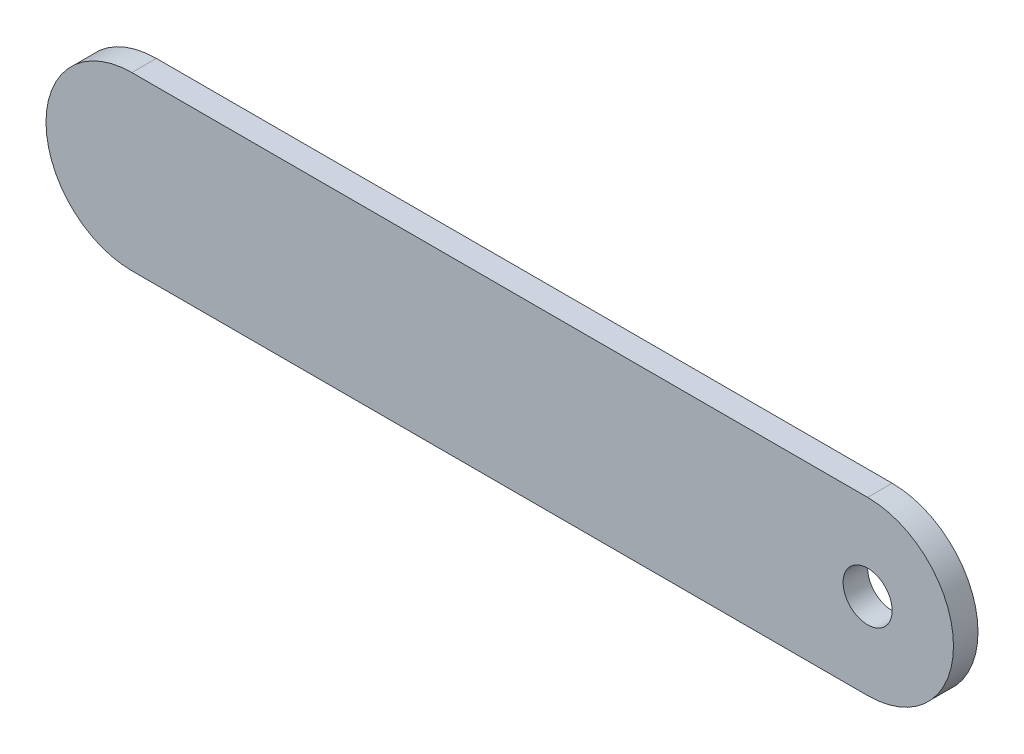
ISO-10303-21;
HEADER;
FILE_DESCRIPTION(('STEP AP214'),'2;1');
FILE_NAME('part.step','',(''),(''),'','','');
FILE_SCHEMA(('AUTOMOTIVE_DESIGN { 1 0 10303 214 1 1 1 1 }'));
ENDSEC;
DATA;
#1=APPLICATION_CONTEXT('core data for automotive mechanical design processes');
#2=APPLICATION_PROTOCOL_DEFINITION('international standard','automotive_design',2000,#1);
#3=PRODUCT_CONTEXT('',#1,'mechanical');
#4=PRODUCT('Part','Part','',(#3));
#5=PRODUCT_RELATED_PRODUCT_CATEGORY('part','',(#4));
#6=PRODUCT_DEFINITION_FORMATION('','',#4);
#7=PRODUCT_DEFINITION_CONTEXT('part definition',#1,'design');
#8=PRODUCT_DEFINITION('design','',#6,#7);
#9=PRODUCT_DEFINITION_SHAPE('','',#8);
#10=(LENGTH_UNIT() NAMED_UNIT(*) SI_UNIT(.MILLI.,.METRE.));
#11=(NAMED_UNIT(*) PLANE_ANGLE_UNIT() SI_UNIT($,.RADIAN.));
#12=(NAMED_UNIT(*) SI_UNIT($,.STERADIAN.) SOLID_ANGLE_UNIT());
#13=UNCERTAINTY_MEASURE_WITH_UNIT(LENGTH_MEASURE(1.E-05),#10,'distance_accuracy_value','');
#14=(GEOMETRIC_REPRESENTATION_CONTEXT(3) GLOBAL_UNCERTAINTY_ASSIGNED_CONTEXT((#13)) GLOBAL_UNIT_ASSIGNED_CONTEXT((#10,
#11,#12)) REPRESENTATION_CONTEXT('',''));
#15=CARTESIAN_POINT('',(0.,0.,0.));
#16=DIRECTION('',(0.,0.,1.));
#17=DIRECTION('',(1.,0.,0.));
#18=AXIS2_PLACEMENT_3D('',#15,#16,#17);
#19=CARTESIAN_POINT('',(-43.8574313745465,0.,2.));
#20=DIRECTION('',(0.,0.,1.));
#21=DIRECTION('',(1.,0.,0.));
#22=AXIS2_PLACEMENT_3D('',#19,#20,#21);
#23=PLANE('',#22);
#24=CARTESIAN_POINT('',(-43.8574313745465,0.,2.));
#25=DIRECTION('',(0.,0.,1.));
#26=DIRECTION('',(1.,0.,0.));
#27=AXIS2_PLACEMENT_3D('',#24,#25,#26);
#28=CIRCLE('',#27,7.);
#29=CARTESIAN_POINT('',(-43.8574313745465,7.,2.));
#30=VERTEX_POINT('',#29);
#31=CARTESIAN_POINT('',(-43.8574313745465,-7.,2.));
#32=VERTEX_POINT('',#31);
#33=EDGE_CURVE('E85',#30,#32,#28,.T.);
#34=ORIENTED_EDGE('',*,*,#33,.T.);
#35=DIRECTION('',(1.,0.,0.));
#36=VECTOR('',#35,1.);
#37=CARTESIAN_POINT('',(-43.8574313745465,-7.,2.));
#38=LINE('',#37,#36);
#39=CARTESIAN_POINT('',(16.1425686254535,-7.,2.));
#40=VERTEX_POINT('',#39);
#41=EDGE_CURVE('E80',#32,#40,#38,.T.);
#42=ORIENTED_EDGE('',*,*,#41,.T.);
#43=CARTESIAN_POINT('',(16.1425686254535,0.,2.));
#44=DIRECTION('',(0.,0.,1.));
#45=DIRECTION('',(1.,0.,0.));
#46=AXIS2_PLACEMENT_3D('',#43,#44,#45);
#47=CIRCLE('',#46,7.);
#48=CARTESIAN_POINT('',(16.1425686254535,7.,2.));
#49=VERTEX_POINT('',#48);
#50=EDGE_CURVE('E83',#40,#49,#47,.T.);
#51=ORIENTED_EDGE('',*,*,#50,.T.);
#52=DIRECTION('',(-1.,0.,0.));
#53=VECTOR('',#52,1.);
#54=CARTESIAN_POINT('',(-43.8574313745465,7.,2.));
#55=LINE('',#54,#53);
#56=EDGE_CURVE('E50',#49,#30,#55,.T.);
#57=ORIENTED_EDGE('',*,*,#56,.T.);
#58=EDGE_LOOP('',(#34,#42,#51,#57));
#59=FACE_BOUND('',#58,.T.);
#60=CARTESIAN_POINT('',(16.1425686254535,0.,2.));
#61=DIRECTION('',(0.,0.,1.));
#62=DIRECTION('',(1.,0.,0.));
#63=AXIS2_PLACEMENT_3D('',#60,#61,#62);
#64=CIRCLE('',#63,2.);
#65=CARTESIAN_POINT('',(18.1425686254535,0.,2.));
#66=VERTEX_POINT('',#65);
#67=EDGE_CURVE('E100',#66,#66,#64,.T.);
#68=ORIENTED_EDGE('',*,*,#67,.F.);
#69=EDGE_LOOP('',(#68));
#70=FACE_BOUND('',#69,.T.);
#71=ADVANCED_FACE('F33',(#59,#70),#23,.T.);
#72=CARTESIAN_POINT('',(-43.8574313745465,0.,0.));
#73=DIRECTION('',(0.,0.,1.));
#74=DIRECTION('',(1.,0.,0.));
#75=AXIS2_PLACEMENT_3D('',#72,#73,#74);
#76=PLANE('',#75);
#77=CARTESIAN_POINT('',(-43.8574313745465,0.,0.));
#78=DIRECTION('',(0.,0.,1.));
#79=DIRECTION('',(1.,0.,0.));
#80=AXIS2_PLACEMENT_3D('',#77,#78,#79);
#81=CIRCLE('',#80,7.);
#82=CARTESIAN_POINT('',(-43.8574313745465,7.,0.));
#83=VERTEX_POINT('',#82);
#84=CARTESIAN_POINT('',(-43.8574313745465,-7.,0.));
#85=VERTEX_POINT('',#84);
#86=EDGE_CURVE('E97',#83,#85,#81,.T.);
#87=ORIENTED_EDGE('',*,*,#86,.F.);
#88=DIRECTION('',(-1.,0.,0.));
#89=VECTOR('',#88,1.);
#90=CARTESIAN_POINT('',(-43.8574313745465,7.,0.));
#91=LINE('',#90,#89);
#92=CARTESIAN_POINT('',(16.1425686254535,7.,0.));
#93=VERTEX_POINT('',#92);
#94=EDGE_CURVE('E73',#93,#83,#91,.T.);
#95=ORIENTED_EDGE('',*,*,#94,.F.);
#96=CARTESIAN_POINT('',(16.1425686254535,0.,0.));
#97=DIRECTION('',(0.,0.,1.));
#98=DIRECTION('',(1.,0.,0.));
#99=AXIS2_PLACEMENT_3D('',#96,#97,#98);
#100=CIRCLE('',#99,7.);
#101=CARTESIAN_POINT('',(16.1425686254535,-7.,0.));
#102=VERTEX_POINT('',#101);
#103=EDGE_CURVE('E67',#102,#93,#100,.T.);
#104=ORIENTED_EDGE('',*,*,#103,.F.);
#105=DIRECTION('',(1.,0.,0.));
#106=VECTOR('',#105,1.);
#107=CARTESIAN_POINT('',(-43.8574313745465,-7.,0.));
#108=LINE('',#107,#106);
#109=EDGE_CURVE('E89',#85,#102,#108,.T.);
#110=ORIENTED_EDGE('',*,*,#109,.F.);
#111=EDGE_LOOP('',(#87,#95,#104,#110));
#112=FACE_BOUND('',#111,.T.);
#113=CARTESIAN_POINT('',(16.1425686254535,0.,0.));
#114=DIRECTION('',(0.,0.,1.));
#115=DIRECTION('',(1.,0.,0.));
#116=AXIS2_PLACEMENT_3D('',#113,#114,#115);
#117=CIRCLE('',#116,2.);
#118=CARTESIAN_POINT('',(18.1425686254535,0.,0.));
#119=VERTEX_POINT('',#118);
#120=EDGE_CURVE('E112',#119,#119,#117,.T.);
#121=ORIENTED_EDGE('',*,*,#120,.T.);
#122=EDGE_LOOP('',(#121));
#123=FACE_BOUND('',#122,.T.);
#124=ADVANCED_FACE('F108',(#112,#123),#76,.F.);
#125=CARTESIAN_POINT('',(-43.8574313745465,0.,2.));
#126=DIRECTION('',(0.,0.,-1.));
#127=DIRECTION('',(-1.,0.,0.));
#128=AXIS2_PLACEMENT_3D('',#125,#126,#127);
#129=CYLINDRICAL_SURFACE('',#128,7.);
#130=ORIENTED_EDGE('',*,*,#86,.T.);
#131=DIRECTION('',(0.,0.,-1.));
#132=VECTOR('',#131,1.);
#133=CARTESIAN_POINT('',(-43.8574313745465,-7.,2.));
#134=LINE('',#133,#132);
#135=EDGE_CURVE('E11',#32,#85,#134,.T.);
#136=ORIENTED_EDGE('',*,*,#135,.F.);
#137=ORIENTED_EDGE('',*,*,#33,.F.);
#138=DIRECTION('',(0.,0.,-1.));
#139=VECTOR('',#138,1.);
#140=CARTESIAN_POINT('',(-43.8574313745465,7.,2.));
#141=LINE('',#140,#139);
#142=EDGE_CURVE('E93',#30,#83,#141,.T.);
#143=ORIENTED_EDGE('',*,*,#142,.T.);
#144=EDGE_LOOP('',(#130,#136,#137,#143));
#145=FACE_BOUND('',#144,.T.);
#146=ADVANCED_FACE('F35',(#145),#129,.T.);
#147=CARTESIAN_POINT('',(-43.8574313745465,-7.,2.));
#148=DIRECTION('',(0.,1.,0.));
#149=DIRECTION('',(0.,0.,1.));
#150=AXIS2_PLACEMENT_3D('',#147,#148,#149);
#151=PLANE('',#150);
#152=ORIENTED_EDGE('',*,*,#109,.T.);
#153=DIRECTION('',(0.,0.,-1.));
#154=VECTOR('',#153,1.);
#155=CARTESIAN_POINT('',(16.1425686254535,-7.,2.));
#156=LINE('',#155,#154);
#157=EDGE_CURVE('E42',#40,#102,#156,.T.);
#158=ORIENTED_EDGE('',*,*,#157,.F.);
#159=ORIENTED_EDGE('',*,*,#41,.F.);
#160=ORIENTED_EDGE('',*,*,#135,.T.);
#161=EDGE_LOOP('',(#152,#158,#159,#160));
#162=FACE_BOUND('',#161,.T.);
#163=ADVANCED_FACE('F88',(#162),#151,.F.);
#164=CARTESIAN_POINT('',(16.1425686254535,0.,2.));
#165=DIRECTION('',(0.,0.,-1.));
#166=DIRECTION('',(-1.,0.,0.));
#167=AXIS2_PLACEMENT_3D('',#164,#165,#166);
#168=CYLINDRICAL_SURFACE('',#167,7.);
#169=ORIENTED_EDGE('',*,*,#103,.T.);
#170=DIRECTION('',(0.,0.,-1.));
#171=VECTOR('',#170,1.);
#172=CARTESIAN_POINT('',(16.1425686254535,7.,2.));
#173=LINE('',#172,#171);
#174=EDGE_CURVE('E90',#49,#93,#173,.T.);
#175=ORIENTED_EDGE('',*,*,#174,.F.);
#176=ORIENTED_EDGE('',*,*,#50,.F.);
#177=ORIENTED_EDGE('',*,*,#157,.T.);
#178=EDGE_LOOP('',(#169,#175,#176,#177));
#179=FACE_BOUND('',#178,.T.);
#180=ADVANCED_FACE('F91',(#179),#168,.T.);
#181=CARTESIAN_POINT('',(-43.8574313745465,7.,2.));
#182=DIRECTION('',(0.,-1.,0.));
#183=DIRECTION('',(0.,0.,-1.));
#184=AXIS2_PLACEMENT_3D('',#181,#182,#183);
#185=PLANE('',#184);
#186=ORIENTED_EDGE('',*,*,#94,.T.);
#187=ORIENTED_EDGE('',*,*,#142,.F.);
#188=ORIENTED_EDGE('',*,*,#56,.F.);
#189=ORIENTED_EDGE('',*,*,#174,.T.);
#190=EDGE_LOOP('',(#186,#187,#188,#189));
#191=FACE_BOUND('',#190,.T.);
#192=ADVANCED_FACE('F105',(#191),#185,.F.);
#193=CARTESIAN_POINT('',(16.1425686254535,0.,2.));
#194=DIRECTION('',(0.,0.,-1.));
#195=DIRECTION('',(-1.,0.,0.));
#196=AXIS2_PLACEMENT_3D('',#193,#194,#195);
#197=CYLINDRICAL_SURFACE('',#196,2.);
#198=ORIENTED_EDGE('',*,*,#67,.T.);
#199=EDGE_LOOP('',(#198));
#200=FACE_BOUND('',#199,.T.);
#201=ORIENTED_EDGE('',*,*,#120,.F.);
#202=EDGE_LOOP('',(#201));
#203=FACE_BOUND('',#202,.T.);
#204=ADVANCED_FACE('F118',(#200,#203),#197,.F.);
#205=CLOSED_SHELL('',(#71,#124,#146,#163,#180,#192,#204));
#206=MANIFOLD_SOLID_BREP('B2',#205);
#207=ADVANCED_BREP_SHAPE_REPRESENTATION('',(#18,#206),#14);
#208=SHAPE_DEFINITION_REPRESENTATION(#9,#207);
ENDSEC;
END-ISO-10303-21;
